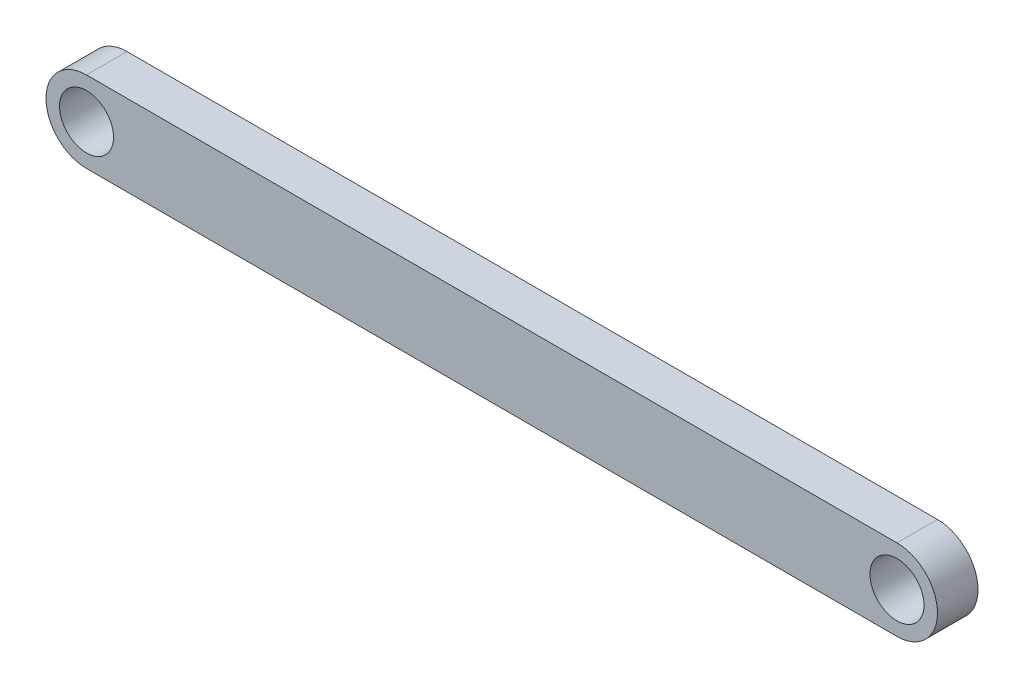
ISO-10303-21;
HEADER;
FILE_DESCRIPTION(('STEP AP214'),'2;1');
FILE_NAME('part.step','',(''),(''),'','','');
FILE_SCHEMA(('AUTOMOTIVE_DESIGN { 1 0 10303 214 1 1 1 1 }'));
ENDSEC;
DATA;
#1=APPLICATION_CONTEXT('core data for automotive mechanical design processes');
#2=APPLICATION_PROTOCOL_DEFINITION('international standard','automotive_design',2000,#1);
#3=PRODUCT_CONTEXT('',#1,'mechanical');
#4=PRODUCT('Part','Part','',(#3));
#5=PRODUCT_RELATED_PRODUCT_CATEGORY('part','',(#4));
#6=PRODUCT_DEFINITION_FORMATION('','',#4);
#7=PRODUCT_DEFINITION_CONTEXT('part definition',#1,'design');
#8=PRODUCT_DEFINITION('design','',#6,#7);
#9=PRODUCT_DEFINITION_SHAPE('','',#8);
#10=(LENGTH_UNIT() NAMED_UNIT(*) SI_UNIT(.MILLI.,.METRE.));
#11=(NAMED_UNIT(*) PLANE_ANGLE_UNIT() SI_UNIT($,.RADIAN.));
#12=(NAMED_UNIT(*) SI_UNIT($,.STERADIAN.) SOLID_ANGLE_UNIT());
#13=UNCERTAINTY_MEASURE_WITH_UNIT(LENGTH_MEASURE(1.E-05),#10,'distance_accuracy_value','');
#14=(GEOMETRIC_REPRESENTATION_CONTEXT(3) GLOBAL_UNCERTAINTY_ASSIGNED_CONTEXT((#13)) GLOBAL_UNIT_ASSIGNED_CONTEXT((#10,
#11,#12)) REPRESENTATION_CONTEXT('',''));
#15=CARTESIAN_POINT('',(0.,0.,0.));
#16=DIRECTION('',(0.,0.,1.));
#17=DIRECTION('',(1.,0.,0.));
#18=AXIS2_PLACEMENT_3D('',#15,#16,#17);
#19=CARTESIAN_POINT('',(-300.,0.,15.));
#20=DIRECTION('',(0.,0.,-1.));
#21=DIRECTION('',(-1.,0.,0.));
#22=AXIS2_PLACEMENT_3D('',#19,#20,#21);
#23=PLANE('',#22);
#24=CARTESIAN_POINT('',(-300.,0.,15.));
#25=DIRECTION('',(0.,0.,1.));
#26=DIRECTION('',(1.,0.,0.));
#27=AXIS2_PLACEMENT_3D('',#24,#25,#26);
#28=CIRCLE('',#27,10.);
#29=CARTESIAN_POINT('',(-290.,0.,15.));
#30=VERTEX_POINT('',#29);
#31=EDGE_CURVE('E90',#30,#30,#28,.T.);
#32=ORIENTED_EDGE('',*,*,#31,.F.);
#33=EDGE_LOOP('',(#32));
#34=FACE_BOUND('',#33,.T.);
#35=CARTESIAN_POINT('',(-300.,0.,15.));
#36=DIRECTION('',(0.,0.,1.));
#37=DIRECTION('',(-1.,0.,0.));
#38=AXIS2_PLACEMENT_3D('',#35,#36,#37);
#39=CIRCLE('',#38,15.);
#40=CARTESIAN_POINT('',(-300.,15.,15.));
#41=VERTEX_POINT('',#40);
#42=CARTESIAN_POINT('',(-300.,-15.,15.));
#43=VERTEX_POINT('',#42);
#44=EDGE_CURVE('E100',#41,#43,#39,.T.);
#45=ORIENTED_EDGE('',*,*,#44,.T.);
#46=DIRECTION('',(1.,0.,0.));
#47=VECTOR('',#46,1.);
#48=CARTESIAN_POINT('',(-300.,-15.,15.));
#49=LINE('',#48,#47);
#50=CARTESIAN_POINT('',(0.,-15.,15.));
#51=VERTEX_POINT('',#50);
#52=EDGE_CURVE('E85',#43,#51,#49,.T.);
#53=ORIENTED_EDGE('',*,*,#52,.T.);
#54=CARTESIAN_POINT('',(0.,0.,15.));
#55=DIRECTION('',(0.,0.,1.));
#56=DIRECTION('',(1.,0.,0.));
#57=AXIS2_PLACEMENT_3D('',#54,#55,#56);
#58=CIRCLE('',#57,15.);
#59=CARTESIAN_POINT('',(0.,15.,15.));
#60=VERTEX_POINT('',#59);
#61=EDGE_CURVE('E51',#51,#60,#58,.T.);
#62=ORIENTED_EDGE('',*,*,#61,.T.);
#63=DIRECTION('',(-1.,0.,0.));
#64=VECTOR('',#63,1.);
#65=CARTESIAN_POINT('',(-300.,15.,15.));
#66=LINE('',#65,#64);
#67=EDGE_CURVE('E46',#60,#41,#66,.T.);
#68=ORIENTED_EDGE('',*,*,#67,.T.);
#69=EDGE_LOOP('',(#45,#53,#62,#68));
#70=FACE_BOUND('',#69,.T.);
#71=CARTESIAN_POINT('',(0.,0.,15.));
#72=DIRECTION('',(0.,0.,1.));
#73=DIRECTION('',(1.,0.,0.));
#74=AXIS2_PLACEMENT_3D('',#71,#72,#73);
#75=CIRCLE('',#74,10.);
#76=CARTESIAN_POINT('',(10.,0.,15.));
#77=VERTEX_POINT('',#76);
#78=EDGE_CURVE('E118',#77,#77,#75,.T.);
#79=ORIENTED_EDGE('',*,*,#78,.F.);
#80=EDGE_LOOP('',(#79));
#81=FACE_BOUND('',#80,.T.);
#82=ADVANCED_FACE('F31',(#34,#70,#81),#23,.F.);
#83=CARTESIAN_POINT('',(-300.,0.,0.));
#84=DIRECTION('',(0.,0.,-1.));
#85=DIRECTION('',(-1.,0.,0.));
#86=AXIS2_PLACEMENT_3D('',#83,#84,#85);
#87=PLANE('',#86);
#88=CARTESIAN_POINT('',(-300.,0.,0.));
#89=DIRECTION('',(0.,0.,1.));
#90=DIRECTION('',(1.,0.,0.));
#91=AXIS2_PLACEMENT_3D('',#88,#89,#90);
#92=CIRCLE('',#91,10.);
#93=CARTESIAN_POINT('',(-290.,0.,0.));
#94=VERTEX_POINT('',#93);
#95=EDGE_CURVE('E93',#94,#94,#92,.T.);
#96=ORIENTED_EDGE('',*,*,#95,.T.);
#97=EDGE_LOOP('',(#96));
#98=FACE_BOUND('',#97,.T.);
#99=CARTESIAN_POINT('',(-300.,0.,0.));
#100=DIRECTION('',(0.,0.,1.));
#101=DIRECTION('',(-1.,0.,0.));
#102=AXIS2_PLACEMENT_3D('',#99,#100,#101);
#103=CIRCLE('',#102,15.);
#104=CARTESIAN_POINT('',(-300.,15.,0.));
#105=VERTEX_POINT('',#104);
#106=CARTESIAN_POINT('',(-300.,-15.,0.));
#107=VERTEX_POINT('',#106);
#108=EDGE_CURVE('E77',#105,#107,#103,.T.);
#109=ORIENTED_EDGE('',*,*,#108,.F.);
#110=DIRECTION('',(-1.,0.,0.));
#111=VECTOR('',#110,1.);
#112=CARTESIAN_POINT('',(-300.,15.,0.));
#113=LINE('',#112,#111);
#114=CARTESIAN_POINT('',(0.,15.,0.));
#115=VERTEX_POINT('',#114);
#116=EDGE_CURVE('E98',#115,#105,#113,.T.);
#117=ORIENTED_EDGE('',*,*,#116,.F.);
#118=CARTESIAN_POINT('',(0.,0.,0.));
#119=DIRECTION('',(0.,0.,1.));
#120=DIRECTION('',(1.,0.,0.));
#121=AXIS2_PLACEMENT_3D('',#118,#119,#120);
#122=CIRCLE('',#121,15.);
#123=CARTESIAN_POINT('',(0.,-15.,0.));
#124=VERTEX_POINT('',#123);
#125=EDGE_CURVE('E78',#124,#115,#122,.T.);
#126=ORIENTED_EDGE('',*,*,#125,.F.);
#127=DIRECTION('',(1.,0.,0.));
#128=VECTOR('',#127,1.);
#129=CARTESIAN_POINT('',(-300.,-15.,0.));
#130=LINE('',#129,#128);
#131=EDGE_CURVE('E72',#107,#124,#130,.T.);
#132=ORIENTED_EDGE('',*,*,#131,.F.);
#133=EDGE_LOOP('',(#109,#117,#126,#132));
#134=FACE_BOUND('',#133,.T.);
#135=CARTESIAN_POINT('',(0.,0.,0.));
#136=DIRECTION('',(0.,0.,1.));
#137=DIRECTION('',(1.,0.,0.));
#138=AXIS2_PLACEMENT_3D('',#135,#136,#137);
#139=CIRCLE('',#138,10.);
#140=CARTESIAN_POINT('',(10.,0.,0.));
#141=VERTEX_POINT('',#140);
#142=EDGE_CURVE('E120',#141,#141,#139,.T.);
#143=ORIENTED_EDGE('',*,*,#142,.T.);
#144=EDGE_LOOP('',(#143));
#145=FACE_BOUND('',#144,.T.);
#146=ADVANCED_FACE('F73',(#98,#134,#145),#87,.T.);
#147=CARTESIAN_POINT('',(-300.,0.,15.));
#148=DIRECTION('',(0.,0.,-1.));
#149=DIRECTION('',(-1.,0.,0.));
#150=AXIS2_PLACEMENT_3D('',#147,#148,#149);
#151=CYLINDRICAL_SURFACE('',#150,15.);
#152=ORIENTED_EDGE('',*,*,#108,.T.);
#153=DIRECTION('',(0.,0.,-1.));
#154=VECTOR('',#153,1.);
#155=CARTESIAN_POINT('',(-300.,-15.,15.));
#156=LINE('',#155,#154);
#157=EDGE_CURVE('E11',#43,#107,#156,.T.);
#158=ORIENTED_EDGE('',*,*,#157,.F.);
#159=ORIENTED_EDGE('',*,*,#44,.F.);
#160=DIRECTION('',(0.,0.,-1.));
#161=VECTOR('',#160,1.);
#162=CARTESIAN_POINT('',(-300.,15.,15.));
#163=LINE('',#162,#161);
#164=EDGE_CURVE('E89',#41,#105,#163,.T.);
#165=ORIENTED_EDGE('',*,*,#164,.T.);
#166=EDGE_LOOP('',(#152,#158,#159,#165));
#167=FACE_BOUND('',#166,.T.);
#168=ADVANCED_FACE('F33',(#167),#151,.T.);
#169=CARTESIAN_POINT('',(-300.,-15.,15.));
#170=DIRECTION('',(0.,1.,0.));
#171=DIRECTION('',(-1.,0.,0.));
#172=AXIS2_PLACEMENT_3D('',#169,#170,#171);
#173=PLANE('',#172);
#174=ORIENTED_EDGE('',*,*,#131,.T.);
#175=DIRECTION('',(0.,0.,-1.));
#176=VECTOR('',#175,1.);
#177=CARTESIAN_POINT('',(0.,-15.,15.));
#178=LINE('',#177,#176);
#179=EDGE_CURVE('E39',#51,#124,#178,.T.);
#180=ORIENTED_EDGE('',*,*,#179,.F.);
#181=ORIENTED_EDGE('',*,*,#52,.F.);
#182=ORIENTED_EDGE('',*,*,#157,.T.);
#183=EDGE_LOOP('',(#174,#180,#181,#182));
#184=FACE_BOUND('',#183,.T.);
#185=ADVANCED_FACE('F84',(#184),#173,.F.);
#186=CARTESIAN_POINT('',(0.,0.,15.));
#187=DIRECTION('',(0.,0.,-1.));
#188=DIRECTION('',(-1.,0.,0.));
#189=AXIS2_PLACEMENT_3D('',#186,#187,#188);
#190=CYLINDRICAL_SURFACE('',#189,15.);
#191=ORIENTED_EDGE('',*,*,#125,.T.);
#192=DIRECTION('',(0.,0.,-1.));
#193=VECTOR('',#192,1.);
#194=CARTESIAN_POINT('',(0.,15.,15.));
#195=LINE('',#194,#193);
#196=EDGE_CURVE('E106',#60,#115,#195,.T.);
#197=ORIENTED_EDGE('',*,*,#196,.F.);
#198=ORIENTED_EDGE('',*,*,#61,.F.);
#199=ORIENTED_EDGE('',*,*,#179,.T.);
#200=EDGE_LOOP('',(#191,#197,#198,#199));
#201=FACE_BOUND('',#200,.T.);
#202=ADVANCED_FACE('F109',(#201),#190,.T.);
#203=CARTESIAN_POINT('',(-300.,15.,15.));
#204=DIRECTION('',(0.,-1.,0.));
#205=DIRECTION('',(0.,0.,-1.));
#206=AXIS2_PLACEMENT_3D('',#203,#204,#205);
#207=PLANE('',#206);
#208=ORIENTED_EDGE('',*,*,#116,.T.);
#209=ORIENTED_EDGE('',*,*,#164,.F.);
#210=ORIENTED_EDGE('',*,*,#67,.F.);
#211=ORIENTED_EDGE('',*,*,#196,.T.);
#212=EDGE_LOOP('',(#208,#209,#210,#211));
#213=FACE_BOUND('',#212,.T.);
#214=ADVANCED_FACE('F111',(#213),#207,.F.);
#215=CARTESIAN_POINT('',(-300.,0.,15.));
#216=DIRECTION('',(0.,0.,-1.));
#217=DIRECTION('',(-1.,0.,0.));
#218=AXIS2_PLACEMENT_3D('',#215,#216,#217);
#219=CYLINDRICAL_SURFACE('',#218,10.);
#220=ORIENTED_EDGE('',*,*,#31,.T.);
#221=EDGE_LOOP('',(#220));
#222=FACE_BOUND('',#221,.T.);
#223=ORIENTED_EDGE('',*,*,#95,.F.);
#224=EDGE_LOOP('',(#223));
#225=FACE_BOUND('',#224,.T.);
#226=ADVANCED_FACE('F129',(#222,#225),#219,.F.);
#227=CARTESIAN_POINT('',(0.,0.,15.));
#228=DIRECTION('',(0.,0.,-1.));
#229=DIRECTION('',(-1.,0.,0.));
#230=AXIS2_PLACEMENT_3D('',#227,#228,#229);
#231=CYLINDRICAL_SURFACE('',#230,10.);
#232=ORIENTED_EDGE('',*,*,#78,.T.);
#233=EDGE_LOOP('',(#232));
#234=FACE_BOUND('',#233,.T.);
#235=ORIENTED_EDGE('',*,*,#142,.F.);
#236=EDGE_LOOP('',(#235));
#237=FACE_BOUND('',#236,.T.);
#238=ADVANCED_FACE('F127',(#234,#237),#231,.F.);
#239=CLOSED_SHELL('',(#82,#146,#168,#185,#202,#214,#226,#238));
#240=MANIFOLD_SOLID_BREP('B2',#239);
#241=ADVANCED_BREP_SHAPE_REPRESENTATION('',(#18,#240),#14);
#242=SHAPE_DEFINITION_REPRESENTATION(#9,#241);
ENDSEC;
END-ISO-10303-21;
